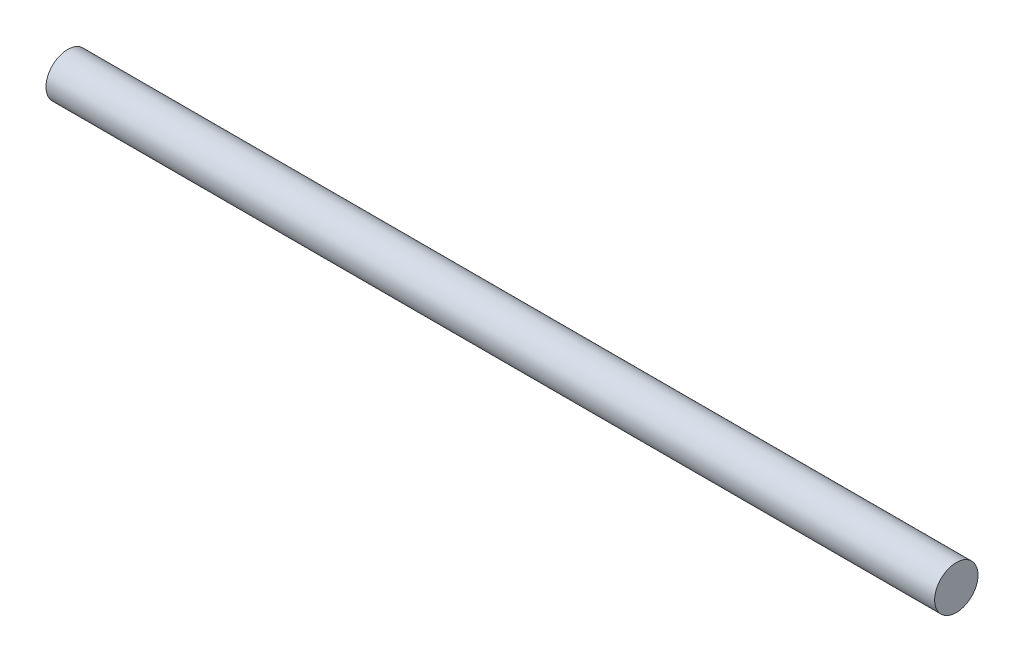
ISO-10303-21;
HEADER;
FILE_DESCRIPTION(('STEP AP214'),'2;1');
FILE_NAME('part.step','',(''),(''),'','','');
FILE_SCHEMA(('AUTOMOTIVE_DESIGN { 1 0 10303 214 1 1 1 1 }'));
ENDSEC;
DATA;
#1=APPLICATION_CONTEXT('core data for automotive mechanical design processes');
#2=APPLICATION_PROTOCOL_DEFINITION('international standard','automotive_design',2000,#1);
#3=PRODUCT_CONTEXT('',#1,'mechanical');
#4=PRODUCT('Part','Part','',(#3));
#5=PRODUCT_RELATED_PRODUCT_CATEGORY('part','',(#4));
#6=PRODUCT_DEFINITION_FORMATION('','',#4);
#7=PRODUCT_DEFINITION_CONTEXT('part definition',#1,'design');
#8=PRODUCT_DEFINITION('design','',#6,#7);
#9=PRODUCT_DEFINITION_SHAPE('','',#8);
#10=(LENGTH_UNIT() NAMED_UNIT(*) SI_UNIT(.MILLI.,.METRE.));
#11=(NAMED_UNIT(*) PLANE_ANGLE_UNIT() SI_UNIT($,.RADIAN.));
#12=(NAMED_UNIT(*) SI_UNIT($,.STERADIAN.) SOLID_ANGLE_UNIT());
#13=UNCERTAINTY_MEASURE_WITH_UNIT(LENGTH_MEASURE(1.E-05),#10,'distance_accuracy_value','');
#14=(GEOMETRIC_REPRESENTATION_CONTEXT(3) GLOBAL_UNCERTAINTY_ASSIGNED_CONTEXT((#13)) GLOBAL_UNIT_ASSIGNED_CONTEXT((#10,
#11,#12)) REPRESENTATION_CONTEXT('',''));
#15=CARTESIAN_POINT('',(0.,0.,0.));
#16=DIRECTION('',(0.,0.,1.));
#17=DIRECTION('',(1.,0.,0.));
#18=AXIS2_PLACEMENT_3D('',#15,#16,#17);
#19=CARTESIAN_POINT('',(863.6,0.,0.));
#20=DIRECTION('',(-1.,0.,0.));
#21=DIRECTION('',(0.,0.,1.));
#22=AXIS2_PLACEMENT_3D('',#19,#20,#21);
#23=CYLINDRICAL_SURFACE('',#22,21.082);
#24=CARTESIAN_POINT('',(863.6,0.,0.));
#25=DIRECTION('',(1.,0.,0.));
#26=DIRECTION('',(0.,0.,-1.));
#27=AXIS2_PLACEMENT_3D('',#24,#25,#26);
#28=CIRCLE('',#27,21.082);
#29=CARTESIAN_POINT('',(863.6,0.,-21.082));
#30=VERTEX_POINT('',#29);
#31=EDGE_CURVE('E10',#30,#30,#28,.T.);
#32=ORIENTED_EDGE('',*,*,#31,.F.);
#33=EDGE_LOOP('',(#32));
#34=FACE_BOUND('',#33,.T.);
#35=CARTESIAN_POINT('',(0.,0.,0.));
#36=DIRECTION('',(1.,0.,0.));
#37=DIRECTION('',(0.,0.,-1.));
#38=AXIS2_PLACEMENT_3D('',#35,#36,#37);
#39=CIRCLE('',#38,21.082);
#40=CARTESIAN_POINT('',(0.,0.,-21.082));
#41=VERTEX_POINT('',#40);
#42=EDGE_CURVE('E40',#41,#41,#39,.T.);
#43=ORIENTED_EDGE('',*,*,#42,.T.);
#44=EDGE_LOOP('',(#43));
#45=FACE_BOUND('',#44,.T.);
#46=ADVANCED_FACE('F37',(#34,#45),#23,.T.);
#47=CARTESIAN_POINT('',(863.6,0.,0.));
#48=DIRECTION('',(1.,0.,0.));
#49=DIRECTION('',(0.,0.,-1.));
#50=AXIS2_PLACEMENT_3D('',#47,#48,#49);
#51=PLANE('',#50);
#52=ORIENTED_EDGE('',*,*,#31,.T.);
#53=EDGE_LOOP('',(#52));
#54=FACE_BOUND('',#53,.T.);
#55=ADVANCED_FACE('F54',(#54),#51,.T.);
#56=CARTESIAN_POINT('',(0.,0.,0.));
#57=DIRECTION('',(1.,0.,0.));
#58=DIRECTION('',(0.,0.,-1.));
#59=AXIS2_PLACEMENT_3D('',#56,#57,#58);
#60=PLANE('',#59);
#61=ORIENTED_EDGE('',*,*,#42,.F.);
#62=EDGE_LOOP('',(#61));
#63=FACE_BOUND('',#62,.T.);
#64=ADVANCED_FACE('F52',(#63),#60,.F.);
#65=CLOSED_SHELL('',(#46,#55,#64));
#66=MANIFOLD_SOLID_BREP('B2',#65);
#67=ADVANCED_BREP_SHAPE_REPRESENTATION('',(#18,#66),#14);
#68=SHAPE_DEFINITION_REPRESENTATION(#9,#67);
ENDSEC;
END-ISO-10303-21;
